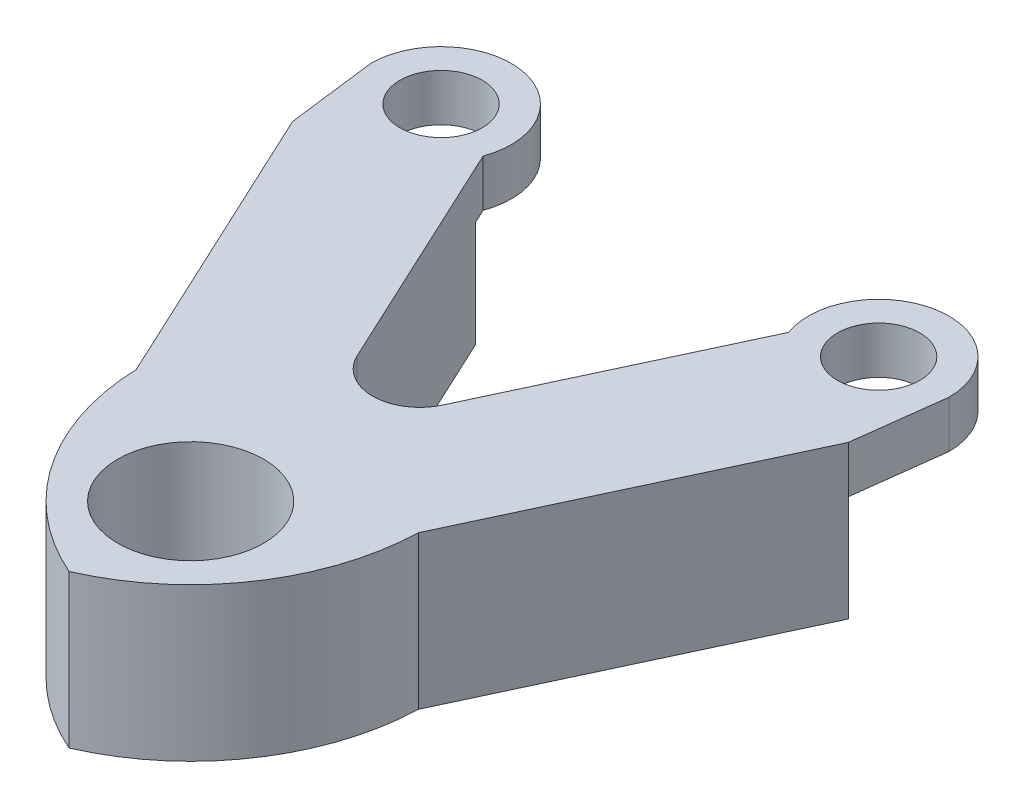
ISO-10303-21;
HEADER;
FILE_DESCRIPTION(('STEP AP214'),'2;1');
FILE_NAME('part.step','',(''),(''),'','','');
FILE_SCHEMA(('AUTOMOTIVE_DESIGN { 1 0 10303 214 1 1 1 1 }'));
ENDSEC;
DATA;
#1=APPLICATION_CONTEXT('core data for automotive mechanical design processes');
#2=APPLICATION_PROTOCOL_DEFINITION('international standard','automotive_design',2000,#1);
#3=PRODUCT_CONTEXT('',#1,'mechanical');
#4=PRODUCT('Part','Part','',(#3));
#5=PRODUCT_RELATED_PRODUCT_CATEGORY('part','',(#4));
#6=PRODUCT_DEFINITION_FORMATION('','',#4);
#7=PRODUCT_DEFINITION_CONTEXT('part definition',#1,'design');
#8=PRODUCT_DEFINITION('design','',#6,#7);
#9=PRODUCT_DEFINITION_SHAPE('','',#8);
#10=(LENGTH_UNIT() NAMED_UNIT(*) SI_UNIT(.MILLI.,.METRE.));
#11=(NAMED_UNIT(*) PLANE_ANGLE_UNIT() SI_UNIT($,.RADIAN.));
#12=(NAMED_UNIT(*) SI_UNIT($,.STERADIAN.) SOLID_ANGLE_UNIT());
#13=UNCERTAINTY_MEASURE_WITH_UNIT(LENGTH_MEASURE(1.E-05),#10,'distance_accuracy_value','');
#14=(GEOMETRIC_REPRESENTATION_CONTEXT(3) GLOBAL_UNCERTAINTY_ASSIGNED_CONTEXT((#13)) GLOBAL_UNIT_ASSIGNED_CONTEXT((#10,
#11,#12)) REPRESENTATION_CONTEXT('',''));
#15=CARTESIAN_POINT('',(0.,0.,0.));
#16=DIRECTION('',(0.,0.,1.));
#17=DIRECTION('',(1.,0.,0.));
#18=AXIS2_PLACEMENT_3D('',#15,#16,#17);
#19=CARTESIAN_POINT('',(0.,6.5,0.));
#20=DIRECTION('',(0.,-1.,0.));
#21=DIRECTION('',(0.,0.,-1.));
#22=AXIS2_PLACEMENT_3D('',#19,#20,#21);
#23=CYLINDRICAL_SURFACE('',#22,20.);
#24=DIRECTION('',(0.,-1.,0.));
#25=VECTOR('',#24,1.);
#26=CARTESIAN_POINT('',(10.8493263239775,9.76597930857815,-16.8015510687511));
#27=LINE('',#26,#25);
#28=CARTESIAN_POINT('',(10.8493263239775,4.5,-16.8015510687511));
#29=VERTEX_POINT('',#28);
#30=CARTESIAN_POINT('',(10.8493263239775,0.,-16.8015510687511));
#31=VERTEX_POINT('',#30);
#32=EDGE_CURVE('E198',#29,#31,#27,.T.);
#33=ORIENTED_EDGE('',*,*,#32,.F.);
#34=CARTESIAN_POINT('',(0.,4.5,0.));
#35=DIRECTION('',(0.,1.,0.));
#36=DIRECTION('',(0.,0.,1.));
#37=AXIS2_PLACEMENT_3D('',#34,#35,#36);
#38=CIRCLE('',#37,20.);
#39=CARTESIAN_POINT('',(11.8090070067052,4.5,-16.1414792852324));
#40=VERTEX_POINT('',#39);
#41=EDGE_CURVE('E229',#40,#29,#38,.T.);
#42=ORIENTED_EDGE('',*,*,#41,.F.);
#43=DIRECTION('',(0.,-1.,0.));
#44=VECTOR('',#43,1.);
#45=CARTESIAN_POINT('',(11.8090070067052,6.5,-16.1414792852324));
#46=LINE('',#45,#44);
#47=CARTESIAN_POINT('',(11.8090070067052,0.,-16.1414792852324));
#48=VERTEX_POINT('',#47);
#49=EDGE_CURVE('E222',#40,#48,#46,.T.);
#50=ORIENTED_EDGE('',*,*,#49,.T.);
#51=CARTESIAN_POINT('',(0.,0.,0.));
#52=DIRECTION('',(0.,1.,0.));
#53=DIRECTION('',(0.,0.,1.));
#54=AXIS2_PLACEMENT_3D('',#51,#52,#53);
#55=CIRCLE('',#54,20.);
#56=EDGE_CURVE('E211',#48,#31,#55,.T.);
#57=ORIENTED_EDGE('',*,*,#56,.T.);
#58=EDGE_LOOP('',(#33,#42,#50,#57));
#59=FACE_BOUND('',#58,.T.);
#60=ADVANCED_FACE('F80',(#59),#23,.T.);
#61=CARTESIAN_POINT('',(0.,0.,0.));
#62=DIRECTION('',(0.,1.,0.));
#63=DIRECTION('',(0.,0.,1.));
#64=AXIS2_PLACEMENT_3D('',#61,#62,#63);
#65=PLANE('',#64);
#66=CARTESIAN_POINT('',(0.,0.,0.));
#67=DIRECTION('',(0.,-1.,0.));
#68=DIRECTION('',(0.,0.,-1.));
#69=AXIS2_PLACEMENT_3D('',#66,#67,#68);
#70=CIRCLE('',#69,3.1);
#71=CARTESIAN_POINT('',(0.,0.,-3.1));
#72=VERTEX_POINT('',#71);
#73=EDGE_CURVE('E336',#72,#72,#70,.T.);
#74=ORIENTED_EDGE('',*,*,#73,.F.);
#75=EDGE_LOOP('',(#74));
#76=FACE_BOUND('',#75,.T.);
#77=DIRECTION('',(-0.422618261740693,0.,0.906307787036653));
#78=VECTOR('',#77,1.);
#79=CARTESIAN_POINT('',(3.5172999415724,0.,1.64014389878331));
#80=LINE('',#79,#78);
#81=CARTESIAN_POINT('',(6.,0.,-3.68402355806427));
#82=VERTEX_POINT('',#81);
#83=EDGE_CURVE('E216',#48,#82,#80,.T.);
#84=ORIENTED_EDGE('',*,*,#83,.T.);
#85=CARTESIAN_POINT('',(-3.99500669775371,0.,-4.));
#86=DIRECTION('',(0.,1.,0.));
#87=DIRECTION('',(0.,0.,1.));
#88=AXIS2_PLACEMENT_3D('',#85,#86,#87);
#89=CIRCLE('',#88,10.);
#90=CARTESIAN_POINT('',(0.,0.,5.16732902676145));
#91=VERTEX_POINT('',#90);
#92=EDGE_CURVE('E257',#82,#91,#89,.F.);
#93=ORIENTED_EDGE('',*,*,#92,.T.);
#94=CARTESIAN_POINT('',(3.99500669775371,0.,-4.));
#95=DIRECTION('',(0.,1.,0.));
#96=DIRECTION('',(0.,0.,1.));
#97=AXIS2_PLACEMENT_3D('',#94,#95,#96);
#98=CIRCLE('',#97,10.);
#99=CARTESIAN_POINT('',(-6.,0.,-3.68402355806427));
#100=VERTEX_POINT('',#99);
#101=EDGE_CURVE('E255',#91,#100,#98,.F.);
#102=ORIENTED_EDGE('',*,*,#101,.T.);
#103=DIRECTION('',(0.422618261740694,0.,0.906307787036653));
#104=VECTOR('',#103,1.);
#105=CARTESIAN_POINT('',(-11.8090070067053,0.,-16.1414792852324));
#106=LINE('',#105,#104);
#107=CARTESIAN_POINT('',(-11.8090070067052,0.,-16.1414792852324));
#108=VERTEX_POINT('',#107);
#109=EDGE_CURVE('E237',#108,#100,#106,.T.);
#110=ORIENTED_EDGE('',*,*,#109,.F.);
#111=CARTESIAN_POINT('',(0.,0.,0.));
#112=DIRECTION('',(0.,1.,0.));
#113=DIRECTION('',(0.,0.,1.));
#114=AXIS2_PLACEMENT_3D('',#111,#112,#113);
#115=CIRCLE('',#114,20.);
#116=CARTESIAN_POINT('',(-10.8493263239775,0.,-16.8015510687511));
#117=VERTEX_POINT('',#116);
#118=EDGE_CURVE('E240',#117,#108,#115,.T.);
#119=ORIENTED_EDGE('',*,*,#118,.F.);
#120=CARTESIAN_POINT('',(-9.29760175829541,0.,-19.9387713148063));
#121=DIRECTION('',(0.,-1.,0.));
#122=DIRECTION('',(0.,0.,-1.));
#123=AXIS2_PLACEMENT_3D('',#120,#121,#122);
#124=CIRCLE('',#123,3.5);
#125=CARTESIAN_POINT('',(-6.2033292675817,0.,-18.3030825445286));
#126=VERTEX_POINT('',#125);
#127=EDGE_CURVE('E267',#126,#117,#124,.T.);
#128=ORIENTED_EDGE('',*,*,#127,.F.);
#129=DIRECTION('',(0.422618261740694,0.,0.906307787036653));
#130=VECTOR('',#129,1.);
#131=CARTESIAN_POINT('',(-6.48994533097687,0.,-18.9177326760088));
#132=LINE('',#131,#130);
#133=CARTESIAN_POINT('',(-1.81261557407331,0.,-8.88716664282367));
#134=VERTEX_POINT('',#133);
#135=EDGE_CURVE('E233',#126,#134,#132,.T.);
#136=ORIENTED_EDGE('',*,*,#135,.T.);
#137=CARTESIAN_POINT('',(0.,0.,-9.73240316630506));
#138=DIRECTION('',(0.,1.,0.));
#139=DIRECTION('',(0.,0.,1.));
#140=AXIS2_PLACEMENT_3D('',#137,#138,#139);
#141=CIRCLE('',#140,2.);
#142=CARTESIAN_POINT('',(1.81261557407331,0.,-8.88716664282368));
#143=VERTEX_POINT('',#142);
#144=EDGE_CURVE('E88',#134,#143,#141,.T.);
#145=ORIENTED_EDGE('',*,*,#144,.T.);
#146=DIRECTION('',(-0.422618261740693,0.,0.906307787036653));
#147=VECTOR('',#146,1.);
#148=CARTESIAN_POINT('',(-1.91511110779742,0.,-0.893030975783625));
#149=LINE('',#148,#147);
#150=CARTESIAN_POINT('',(6.20332926758169,0.,-18.3030825445287));
#151=VERTEX_POINT('',#150);
#152=EDGE_CURVE('E204',#151,#143,#149,.T.);
#153=ORIENTED_EDGE('',*,*,#152,.F.);
#154=CARTESIAN_POINT('',(9.29760175829541,0.,-19.9387713148063));
#155=DIRECTION('',(0.,-1.,0.));
#156=DIRECTION('',(0.,0.,-1.));
#157=AXIS2_PLACEMENT_3D('',#154,#155,#156);
#158=CIRCLE('',#157,3.5);
#159=EDGE_CURVE('E192',#151,#31,#158,.F.);
#160=ORIENTED_EDGE('',*,*,#159,.T.);
#161=ORIENTED_EDGE('',*,*,#56,.F.);
#162=EDGE_LOOP('',(#84,#93,#102,#110,#119,#128,#136,#145,#153,#160,#161));
#163=FACE_BOUND('',#162,.T.);
#164=ADVANCED_FACE('F209',(#76,#163),#65,.F.);
#165=CARTESIAN_POINT('',(-1.91511110779742,6.5,-0.893030975783625));
#166=DIRECTION('',(0.906307787036653,0.,0.422618261740693));
#167=DIRECTION('',(0.422618261740693,0.,-0.906307787036653));
#168=AXIS2_PLACEMENT_3D('',#165,#166,#167);
#169=PLANE('',#168);
#170=ORIENTED_EDGE('',*,*,#152,.T.);
#171=DIRECTION('',(0.,-1.,0.));
#172=VECTOR('',#171,1.);
#173=CARTESIAN_POINT('',(1.8126155740733,6.5,-8.88716664282367));
#174=LINE('',#173,#172);
#175=CARTESIAN_POINT('',(1.81261557407331,6.5,-8.88716664282368));
#176=VERTEX_POINT('',#175);
#177=EDGE_CURVE('E95',#143,#176,#174,.F.);
#178=ORIENTED_EDGE('',*,*,#177,.T.);
#179=DIRECTION('',(-0.422618261740693,0.,0.906307787036653));
#180=VECTOR('',#179,1.);
#181=CARTESIAN_POINT('',(-1.91511110779742,6.5,-0.893030975783625));
#182=LINE('',#181,#180);
#183=CARTESIAN_POINT('',(6.48994533097686,6.5,-18.9177326760088));
#184=VERTEX_POINT('',#183);
#185=EDGE_CURVE('E214',#184,#176,#182,.T.);
#186=ORIENTED_EDGE('',*,*,#185,.F.);
#187=DIRECTION('',(0.,-1.,0.));
#188=VECTOR('',#187,1.);
#189=CARTESIAN_POINT('',(6.48994533097686,6.5,-18.9177326760088));
#190=LINE('',#189,#188);
#191=CARTESIAN_POINT('',(6.48994533097686,4.5,-18.9177326760088));
#192=VERTEX_POINT('',#191);
#193=EDGE_CURVE('E220',#184,#192,#190,.T.);
#194=ORIENTED_EDGE('',*,*,#193,.T.);
#195=DIRECTION('',(-0.422618261740693,0.,0.906307787036653));
#196=VECTOR('',#195,1.);
#197=CARTESIAN_POINT('',(-1.91511110779742,4.5,-0.893030975783625));
#198=LINE('',#197,#196);
#199=CARTESIAN_POINT('',(6.20332926758169,4.5,-18.3030825445287));
#200=VERTEX_POINT('',#199);
#201=EDGE_CURVE('E206',#192,#200,#198,.T.);
#202=ORIENTED_EDGE('',*,*,#201,.T.);
#203=DIRECTION('',(0.,-1.,0.));
#204=VECTOR('',#203,1.);
#205=CARTESIAN_POINT('',(6.20332926758169,9.76597930857815,-18.3030825445287));
#206=LINE('',#205,#204);
#207=EDGE_CURVE('E195',#200,#151,#206,.T.);
#208=ORIENTED_EDGE('',*,*,#207,.T.);
#209=EDGE_LOOP('',(#170,#178,#186,#194,#202,#208));
#210=FACE_BOUND('',#209,.T.);
#211=ADVANCED_FACE('F203',(#210),#169,.F.);
#212=CARTESIAN_POINT('',(3.5172999415724,6.5,1.64014389878331));
#213=DIRECTION('',(0.906307787036653,0.,0.422618261740693));
#214=DIRECTION('',(0.422618261740693,0.,-0.906307787036653));
#215=AXIS2_PLACEMENT_3D('',#212,#213,#214);
#216=PLANE('',#215);
#217=ORIENTED_EDGE('',*,*,#83,.F.);
#218=ORIENTED_EDGE('',*,*,#49,.F.);
#219=CARTESIAN_POINT('',(11.8090070067052,6.5,-16.1414792852324));
#220=VERTEX_POINT('',#219);
#221=EDGE_CURVE('E223',#220,#40,#46,.T.);
#222=ORIENTED_EDGE('',*,*,#221,.F.);
#223=DIRECTION('',(-0.422618261740693,0.,0.906307787036653));
#224=VECTOR('',#223,1.);
#225=CARTESIAN_POINT('',(3.5172999415724,6.5,1.64014389878331));
#226=LINE('',#225,#224);
#227=CARTESIAN_POINT('',(6.,6.5,-3.68402355806427));
#228=VERTEX_POINT('',#227);
#229=EDGE_CURVE('E210',#220,#228,#226,.T.);
#230=ORIENTED_EDGE('',*,*,#229,.T.);
#231=DIRECTION('',(0.,-1.,0.));
#232=VECTOR('',#231,1.);
#233=CARTESIAN_POINT('',(6.,6.5,-3.68402355806427));
#234=LINE('',#233,#232);
#235=EDGE_CURVE('E226',#228,#82,#234,.T.);
#236=ORIENTED_EDGE('',*,*,#235,.T.);
#237=EDGE_LOOP('',(#217,#218,#222,#230,#236));
#238=FACE_BOUND('',#237,.T.);
#239=ADVANCED_FACE('F344',(#238),#216,.T.);
#240=CARTESIAN_POINT('',(0.,6.5,0.));
#241=DIRECTION('',(0.,1.,0.));
#242=DIRECTION('',(0.,0.,1.));
#243=AXIS2_PLACEMENT_3D('',#240,#241,#242);
#244=PLANE('',#243);
#245=CARTESIAN_POINT('',(3.99500669775371,6.5,-4.));
#246=DIRECTION('',(0.,1.,0.));
#247=DIRECTION('',(0.,0.,1.));
#248=AXIS2_PLACEMENT_3D('',#245,#246,#247);
#249=CIRCLE('',#248,10.);
#250=CARTESIAN_POINT('',(-6.,6.5,-3.68402355806427));
#251=VERTEX_POINT('',#250);
#252=CARTESIAN_POINT('',(0.,6.5,5.16732902676145));
#253=VERTEX_POINT('',#252);
#254=EDGE_CURVE('E259',#251,#253,#249,.T.);
#255=ORIENTED_EDGE('',*,*,#254,.T.);
#256=CARTESIAN_POINT('',(-3.99500669775371,6.5,-4.));
#257=DIRECTION('',(0.,1.,0.));
#258=DIRECTION('',(0.,0.,1.));
#259=AXIS2_PLACEMENT_3D('',#256,#257,#258);
#260=CIRCLE('',#259,10.);
#261=EDGE_CURVE('E261',#253,#228,#260,.T.);
#262=ORIENTED_EDGE('',*,*,#261,.T.);
#263=ORIENTED_EDGE('',*,*,#229,.F.);
#264=DIRECTION('',(0.124416313592816,0.,-0.992230104820436));
#265=VECTOR('',#264,1.);
#266=CARTESIAN_POINT('',(12.2851516768374,6.5,-19.9387713148063));
#267=LINE('',#266,#265);
#268=CARTESIAN_POINT('',(12.2851516768374,6.5,-19.9387713148063));
#269=VERTEX_POINT('',#268);
#270=EDGE_CURVE('E305',#220,#269,#267,.T.);
#271=ORIENTED_EDGE('',*,*,#270,.T.);
#272=CARTESIAN_POINT('',(9.29760175829541,6.5,-19.9387713148063));
#273=DIRECTION('',(0.,1.,0.));
#274=DIRECTION('',(0.,0.,1.));
#275=AXIS2_PLACEMENT_3D('',#272,#273,#274);
#276=CIRCLE('',#275,2.98754991854204);
#277=EDGE_CURVE('E297',#269,#184,#276,.T.);
#278=ORIENTED_EDGE('',*,*,#277,.T.);
#279=ORIENTED_EDGE('',*,*,#185,.T.);
#280=CARTESIAN_POINT('',(0.,6.5,-9.73240316630506));
#281=DIRECTION('',(0.,1.,0.));
#282=DIRECTION('',(0.,0.,1.));
#283=AXIS2_PLACEMENT_3D('',#280,#281,#282);
#284=CIRCLE('',#283,2.);
#285=CARTESIAN_POINT('',(-1.81261557407331,6.5,-8.88716664282367));
#286=VERTEX_POINT('',#285);
#287=EDGE_CURVE('E12',#176,#286,#284,.F.);
#288=ORIENTED_EDGE('',*,*,#287,.T.);
#289=DIRECTION('',(0.422618261740694,0.,0.906307787036653));
#290=VECTOR('',#289,1.);
#291=CARTESIAN_POINT('',(-6.48994533097687,6.5,-18.9177326760088));
#292=LINE('',#291,#290);
#293=CARTESIAN_POINT('',(-6.48994533097687,6.5,-18.9177326760088));
#294=VERTEX_POINT('',#293);
#295=EDGE_CURVE('E232',#294,#286,#292,.T.);
#296=ORIENTED_EDGE('',*,*,#295,.F.);
#297=CARTESIAN_POINT('',(-9.29760175829541,6.5,-19.9387713148063));
#298=DIRECTION('',(0.,1.,0.));
#299=DIRECTION('',(0.,0.,-1.));
#300=AXIS2_PLACEMENT_3D('',#297,#298,#299);
#301=CIRCLE('',#300,2.98754991854204);
#302=CARTESIAN_POINT('',(-12.2851516768374,6.5,-19.9387713148063));
#303=VERTEX_POINT('',#302);
#304=EDGE_CURVE('E318',#294,#303,#301,.T.);
#305=ORIENTED_EDGE('',*,*,#304,.T.);
#306=DIRECTION('',(0.124416313592816,0.,0.992230104820436));
#307=VECTOR('',#306,1.);
#308=CARTESIAN_POINT('',(-12.2851516768374,6.5,-19.9387713148063));
#309=LINE('',#308,#307);
#310=CARTESIAN_POINT('',(-11.8090070067052,6.5,-16.1414792852324));
#311=VERTEX_POINT('',#310);
#312=EDGE_CURVE('E324',#303,#311,#309,.T.);
#313=ORIENTED_EDGE('',*,*,#312,.T.);
#314=DIRECTION('',(0.422618261740694,0.,0.906307787036653));
#315=VECTOR('',#314,1.);
#316=CARTESIAN_POINT('',(-11.8090070067053,6.5,-16.1414792852324));
#317=LINE('',#316,#315);
#318=EDGE_CURVE('E230',#311,#251,#317,.T.);
#319=ORIENTED_EDGE('',*,*,#318,.T.);
#320=EDGE_LOOP('',(#255,#262,#263,#271,#278,#279,#288,#296,#305,#313,#319));
#321=FACE_BOUND('',#320,.T.);
#322=CARTESIAN_POINT('',(0.,6.5,0.));
#323=DIRECTION('',(0.,-1.,0.));
#324=DIRECTION('',(0.,0.,-1.));
#325=AXIS2_PLACEMENT_3D('',#322,#323,#324);
#326=CIRCLE('',#325,3.1);
#327=CARTESIAN_POINT('',(0.,6.5,-3.1));
#328=VERTEX_POINT('',#327);
#329=EDGE_CURVE('E241',#328,#328,#326,.T.);
#330=ORIENTED_EDGE('',*,*,#329,.T.);
#331=EDGE_LOOP('',(#330));
#332=FACE_BOUND('',#331,.T.);
#333=CARTESIAN_POINT('',(-9.29760175829541,6.5,-19.9387713148063));
#334=DIRECTION('',(0.,1.,0.));
#335=DIRECTION('',(0.,0.,-1.));
#336=AXIS2_PLACEMENT_3D('',#333,#334,#335);
#337=CIRCLE('',#336,1.75);
#338=CARTESIAN_POINT('',(-9.29760175829541,6.5,-21.6887713148063));
#339=VERTEX_POINT('',#338);
#340=EDGE_CURVE('E314',#339,#339,#337,.T.);
#341=ORIENTED_EDGE('',*,*,#340,.F.);
#342=EDGE_LOOP('',(#341));
#343=FACE_BOUND('',#342,.T.);
#344=CARTESIAN_POINT('',(9.29760175829541,6.5,-19.9387713148063));
#345=DIRECTION('',(0.,1.,0.));
#346=DIRECTION('',(0.,0.,1.));
#347=AXIS2_PLACEMENT_3D('',#344,#345,#346);
#348=CIRCLE('',#347,1.75);
#349=CARTESIAN_POINT('',(9.29760175829541,6.5,-18.1887713148063));
#350=VERTEX_POINT('',#349);
#351=EDGE_CURVE('E298',#350,#350,#348,.T.);
#352=ORIENTED_EDGE('',*,*,#351,.F.);
#353=EDGE_LOOP('',(#352));
#354=FACE_BOUND('',#353,.T.);
#355=ADVANCED_FACE('F375',(#321,#332,#343,#354),#244,.T.);
#356=CARTESIAN_POINT('',(-11.8090070067053,6.5,-16.1414792852324));
#357=DIRECTION('',(0.906307787036653,0.,-0.422618261740694));
#358=DIRECTION('',(-0.422618261740694,0.,-0.906307787036653));
#359=AXIS2_PLACEMENT_3D('',#356,#357,#358);
#360=PLANE('',#359);
#361=ORIENTED_EDGE('',*,*,#109,.T.);
#362=DIRECTION('',(0.,-1.,0.));
#363=VECTOR('',#362,1.);
#364=CARTESIAN_POINT('',(-6.,6.5,-3.68402355806427));
#365=LINE('',#364,#363);
#366=EDGE_CURVE('E236',#251,#100,#365,.T.);
#367=ORIENTED_EDGE('',*,*,#366,.F.);
#368=ORIENTED_EDGE('',*,*,#318,.F.);
#369=DIRECTION('',(0.,-1.,0.));
#370=VECTOR('',#369,1.);
#371=CARTESIAN_POINT('',(-11.8090070067052,6.5,-16.1414792852324));
#372=LINE('',#371,#370);
#373=CARTESIAN_POINT('',(-11.8090070067052,4.5,-16.1414792852324));
#374=VERTEX_POINT('',#373);
#375=EDGE_CURVE('E247',#311,#374,#372,.T.);
#376=ORIENTED_EDGE('',*,*,#375,.T.);
#377=EDGE_CURVE('E250',#374,#108,#372,.T.);
#378=ORIENTED_EDGE('',*,*,#377,.T.);
#379=EDGE_LOOP('',(#361,#367,#368,#376,#378));
#380=FACE_BOUND('',#379,.T.);
#381=ADVANCED_FACE('F358',(#380),#360,.F.);
#382=CARTESIAN_POINT('',(0.,6.5,0.));
#383=DIRECTION('',(0.,-1.,0.));
#384=DIRECTION('',(0.,0.,-1.));
#385=AXIS2_PLACEMENT_3D('',#382,#383,#384);
#386=CYLINDRICAL_SURFACE('',#385,20.);
#387=CARTESIAN_POINT('',(0.,4.5,0.));
#388=DIRECTION('',(0.,-1.,0.));
#389=DIRECTION('',(0.,0.,-1.));
#390=AXIS2_PLACEMENT_3D('',#387,#388,#389);
#391=CIRCLE('',#390,20.);
#392=CARTESIAN_POINT('',(-10.8493263239775,4.5,-16.8015510687511));
#393=VERTEX_POINT('',#392);
#394=EDGE_CURVE('E333',#374,#393,#391,.T.);
#395=ORIENTED_EDGE('',*,*,#394,.T.);
#396=DIRECTION('',(0.,-1.,0.));
#397=VECTOR('',#396,1.);
#398=CARTESIAN_POINT('',(-10.8493263239775,9.76597930857815,-16.8015510687511));
#399=LINE('',#398,#397);
#400=EDGE_CURVE('E286',#393,#117,#399,.T.);
#401=ORIENTED_EDGE('',*,*,#400,.T.);
#402=ORIENTED_EDGE('',*,*,#118,.T.);
#403=ORIENTED_EDGE('',*,*,#377,.F.);
#404=EDGE_LOOP('',(#395,#401,#402,#403));
#405=FACE_BOUND('',#404,.T.);
#406=ADVANCED_FACE('F362',(#405),#386,.T.);
#407=CARTESIAN_POINT('',(-6.48994533097687,6.5,-18.9177326760088));
#408=DIRECTION('',(0.906307787036653,0.,-0.422618261740694));
#409=DIRECTION('',(-0.422618261740694,0.,-0.906307787036653));
#410=AXIS2_PLACEMENT_3D('',#407,#408,#409);
#411=PLANE('',#410);
#412=ORIENTED_EDGE('',*,*,#295,.T.);
#413=DIRECTION('',(0.,-1.,0.));
#414=VECTOR('',#413,1.);
#415=CARTESIAN_POINT('',(-1.81261557407331,6.5,-8.88716664282367));
#416=LINE('',#415,#414);
#417=EDGE_CURVE('E263',#286,#134,#416,.T.);
#418=ORIENTED_EDGE('',*,*,#417,.T.);
#419=ORIENTED_EDGE('',*,*,#135,.F.);
#420=DIRECTION('',(0.,-1.,0.));
#421=VECTOR('',#420,1.);
#422=CARTESIAN_POINT('',(-6.2033292675817,9.76597930857815,-18.3030825445286));
#423=LINE('',#422,#421);
#424=CARTESIAN_POINT('',(-6.2033292675817,4.5,-18.3030825445286));
#425=VERTEX_POINT('',#424);
#426=EDGE_CURVE('E284',#425,#126,#423,.T.);
#427=ORIENTED_EDGE('',*,*,#426,.F.);
#428=DIRECTION('',(-0.422618261740694,0.,-0.906307787036653));
#429=VECTOR('',#428,1.);
#430=CARTESIAN_POINT('',(1.91511110779742,4.5,-0.893030975783628));
#431=LINE('',#430,#429);
#432=CARTESIAN_POINT('',(-6.48994533097687,4.5,-18.9177326760088));
#433=VERTEX_POINT('',#432);
#434=EDGE_CURVE('E290',#425,#433,#431,.T.);
#435=ORIENTED_EDGE('',*,*,#434,.T.);
#436=DIRECTION('',(0.,-1.,0.));
#437=VECTOR('',#436,1.);
#438=CARTESIAN_POINT('',(-6.48994533097687,6.5,-18.9177326760088));
#439=LINE('',#438,#437);
#440=EDGE_CURVE('E244',#294,#433,#439,.T.);
#441=ORIENTED_EDGE('',*,*,#440,.F.);
#442=EDGE_LOOP('',(#412,#418,#419,#427,#435,#441));
#443=FACE_BOUND('',#442,.T.);
#444=ADVANCED_FACE('F273',(#443),#411,.T.);
#445=CARTESIAN_POINT('',(0.,6.5,0.));
#446=DIRECTION('',(0.,-1.,0.));
#447=DIRECTION('',(0.,0.,-1.));
#448=AXIS2_PLACEMENT_3D('',#445,#446,#447);
#449=CYLINDRICAL_SURFACE('',#448,3.1);
#450=CARTESIAN_POINT('',(0.,6.5,-3.1));
#451=CARTESIAN_POINT('',(0.,6.43229166666667,-3.1));
#452=CARTESIAN_POINT('',(0.,6.36458333333333,-3.1));
#453=CARTESIAN_POINT('',(0.,6.22916666666667,-3.1));
#454=CARTESIAN_POINT('',(0.,6.16145833333333,-3.1));
#455=CARTESIAN_POINT('',(0.,6.02604166666667,-3.1));
#456=CARTESIAN_POINT('',(0.,5.95833333333333,-3.1));
#457=CARTESIAN_POINT('',(0.,5.82291666666667,-3.1));
#458=CARTESIAN_POINT('',(0.,5.75520833333333,-3.1));
#459=CARTESIAN_POINT('',(0.,5.61979166666667,-3.1));
#460=CARTESIAN_POINT('',(0.,5.55208333333333,-3.1));
#461=CARTESIAN_POINT('',(0.,5.41666666666667,-3.1));
#462=CARTESIAN_POINT('',(0.,5.34895833333333,-3.1));
#463=CARTESIAN_POINT('',(0.,5.21354166666667,-3.1));
#464=CARTESIAN_POINT('',(0.,5.14583333333333,-3.1));
#465=CARTESIAN_POINT('',(0.,5.01041666666667,-3.1));
#466=CARTESIAN_POINT('',(0.,4.94270833333333,-3.1));
#467=CARTESIAN_POINT('',(0.,4.80729166666667,-3.1));
#468=CARTESIAN_POINT('',(0.,4.73958333333333,-3.1));
#469=CARTESIAN_POINT('',(0.,4.60416666666667,-3.1));
#470=CARTESIAN_POINT('',(0.,4.53645833333333,-3.1));
#471=CARTESIAN_POINT('',(0.,4.40104166666667,-3.1));
#472=CARTESIAN_POINT('',(0.,4.33333333333333,-3.1));
#473=CARTESIAN_POINT('',(0.,4.19791666666667,-3.1));
#474=CARTESIAN_POINT('',(0.,4.13020833333333,-3.1));
#475=CARTESIAN_POINT('',(0.,3.99479166666667,-3.1));
#476=CARTESIAN_POINT('',(0.,3.92708333333333,-3.1));
#477=CARTESIAN_POINT('',(0.,3.79166666666667,-3.1));
#478=CARTESIAN_POINT('',(0.,3.72395833333333,-3.1));
#479=CARTESIAN_POINT('',(0.,3.58854166666667,-3.1));
#480=CARTESIAN_POINT('',(0.,3.52083333333333,-3.1));
#481=CARTESIAN_POINT('',(0.,3.38541666666667,-3.1));
#482=CARTESIAN_POINT('',(0.,3.31770833333333,-3.1));
#483=CARTESIAN_POINT('',(0.,3.18229166666667,-3.1));
#484=CARTESIAN_POINT('',(0.,3.11458333333333,-3.1));
#485=CARTESIAN_POINT('',(0.,2.97916666666667,-3.1));
#486=CARTESIAN_POINT('',(0.,2.91145833333333,-3.1));
#487=CARTESIAN_POINT('',(0.,2.77604166666667,-3.1));
#488=CARTESIAN_POINT('',(0.,2.70833333333333,-3.1));
#489=CARTESIAN_POINT('',(0.,2.57291666666667,-3.1));
#490=CARTESIAN_POINT('',(0.,2.50520833333333,-3.1));
#491=CARTESIAN_POINT('',(0.,2.36979166666667,-3.1));
#492=CARTESIAN_POINT('',(0.,2.30208333333333,-3.1));
#493=CARTESIAN_POINT('',(0.,2.16666666666667,-3.1));
#494=CARTESIAN_POINT('',(0.,2.09895833333333,-3.1));
#495=CARTESIAN_POINT('',(0.,1.96354166666667,-3.1));
#496=CARTESIAN_POINT('',(0.,1.89583333333333,-3.1));
#497=CARTESIAN_POINT('',(0.,1.76041666666667,-3.1));
#498=CARTESIAN_POINT('',(0.,1.69270833333333,-3.1));
#499=CARTESIAN_POINT('',(0.,1.55729166666667,-3.1));
#500=CARTESIAN_POINT('',(0.,1.48958333333333,-3.1));
#501=CARTESIAN_POINT('',(0.,1.35416666666667,-3.1));
#502=CARTESIAN_POINT('',(0.,1.28645833333333,-3.1));
#503=CARTESIAN_POINT('',(0.,1.15104166666667,-3.1));
#504=CARTESIAN_POINT('',(0.,1.08333333333333,-3.1));
#505=CARTESIAN_POINT('',(0.,0.947916666666667,-3.1));
#506=CARTESIAN_POINT('',(0.,0.880208333333333,-3.1));
#507=CARTESIAN_POINT('',(0.,0.744791666666667,-3.1));
#508=CARTESIAN_POINT('',(0.,0.677083333333333,-3.1));
#509=CARTESIAN_POINT('',(0.,0.541666666666667,-3.1));
#510=CARTESIAN_POINT('',(0.,0.473958333333333,-3.1));
#511=CARTESIAN_POINT('',(0.,0.338541666666667,-3.1));
#512=CARTESIAN_POINT('',(0.,0.270833333333334,-3.1));
#513=CARTESIAN_POINT('',(0.,0.135416666666667,-3.1));
#514=CARTESIAN_POINT('',(0.,0.0677083333333334,-3.1));
#515=CARTESIAN_POINT('',(0.,0.,-3.1));
#516=B_SPLINE_CURVE_WITH_KNOTS('',3,(#450,#451,#452,#453,#454,#455,#456,#457,#458,#459,#460,
#461,#462,#463,#464,#465,#466,#467,#468,#469,#470,#471,#472,#473,#474,#475,#476,#477,#478,#479,
#480,#481,#482,#483,#484,#485,#486,#487,#488,#489,#490,#491,#492,#493,#494,#495,#496,#497,#498,
#499,#500,#501,#502,#503,#504,#505,#506,#507,#508,#509,#510,#511,#512,#513,#514,#515),
.UNSPECIFIED.,.F.,.F.,(4,2,2,2,2,2,2,2,2,2,2,2,2,2,2,2,2,2,2,2,2,2,2,2,2,2,2,2,2,2,2,2,4),(0.,
0.203124999999999,0.40625,0.609375,0.8125,1.015625,1.21875,1.421875,1.625,1.828125,2.03125,
2.234375,2.4375,2.640625,2.84375,3.046875,3.25,3.453125,3.65625,3.859375,4.0625,4.265625,
4.46875,4.671875,4.875,5.078125,5.28125,5.484375,5.6875,5.890625,6.09375,6.296875,6.5),.UNSPECIFIED.);
#517=EDGE_CURVE('BSEAM396',#328,#72,#516,.T.);
#518=ORIENTED_EDGE('',*,*,#329,.F.);
#519=ORIENTED_EDGE('',*,*,#73,.T.);
#520=ORIENTED_EDGE('',*,*,#517,.T.);
#521=ORIENTED_EDGE('',*,*,#517,.F.);
#522=EDGE_LOOP('',(#518,#520,#519,#521));
#523=FACE_BOUND('',#522,.T.);
#524=ADVANCED_FACE('F396',(#523),#449,.F.);
#525=CARTESIAN_POINT('',(-9.29760175829541,4.5,-19.9387713148063));
#526=DIRECTION('',(0.,-1.,0.));
#527=DIRECTION('',(0.,0.,-1.));
#528=AXIS2_PLACEMENT_3D('',#525,#526,#527);
#529=PLANE('',#528);
#530=CARTESIAN_POINT('',(-9.29760175829541,4.5,-19.9387713148063));
#531=DIRECTION('',(0.,1.,0.));
#532=DIRECTION('',(0.,0.,-1.));
#533=AXIS2_PLACEMENT_3D('',#530,#531,#532);
#534=CIRCLE('',#533,1.75);
#535=CARTESIAN_POINT('',(-9.29760175829541,4.5,-21.6887713148063));
#536=VERTEX_POINT('',#535);
#537=EDGE_CURVE('E315',#536,#536,#534,.T.);
#538=ORIENTED_EDGE('',*,*,#537,.T.);
#539=EDGE_LOOP('',(#538));
#540=FACE_BOUND('',#539,.T.);
#541=ORIENTED_EDGE('',*,*,#394,.F.);
#542=DIRECTION('',(0.124416313592816,0.,0.992230104820436));
#543=VECTOR('',#542,1.);
#544=CARTESIAN_POINT('',(-12.2851516768374,4.5,-19.9387713148063));
#545=LINE('',#544,#543);
#546=CARTESIAN_POINT('',(-12.2851516768374,4.5,-19.9387713148063));
#547=VERTEX_POINT('',#546);
#548=EDGE_CURVE('E323',#547,#374,#545,.T.);
#549=ORIENTED_EDGE('',*,*,#548,.F.);
#550=CARTESIAN_POINT('',(-9.29760175829541,4.5,-19.9387713148063));
#551=DIRECTION('',(0.,1.,0.));
#552=DIRECTION('',(0.,0.,-1.));
#553=AXIS2_PLACEMENT_3D('',#550,#551,#552);
#554=CIRCLE('',#553,2.98754991854204);
#555=EDGE_CURVE('E321',#433,#547,#554,.T.);
#556=ORIENTED_EDGE('',*,*,#555,.F.);
#557=ORIENTED_EDGE('',*,*,#434,.F.);
#558=CARTESIAN_POINT('',(-9.29760175829541,4.5,-19.9387713148063));
#559=DIRECTION('',(0.,-1.,0.));
#560=DIRECTION('',(0.,0.,-1.));
#561=AXIS2_PLACEMENT_3D('',#558,#559,#560);
#562=CIRCLE('',#561,3.5);
#563=EDGE_CURVE('E201',#393,#425,#562,.F.);
#564=ORIENTED_EDGE('',*,*,#563,.F.);
#565=EDGE_LOOP('',(#541,#549,#556,#557,#564));
#566=FACE_BOUND('',#565,.T.);
#567=ADVANCED_FACE('F367',(#540,#566),#529,.T.);
#568=CARTESIAN_POINT('',(-9.29760175829541,4.5,-19.9387713148063));
#569=DIRECTION('',(0.,1.,0.));
#570=DIRECTION('',(0.,0.,1.));
#571=AXIS2_PLACEMENT_3D('',#568,#569,#570);
#572=CYLINDRICAL_SURFACE('',#571,2.98754991854204);
#573=ORIENTED_EDGE('',*,*,#304,.F.);
#574=ORIENTED_EDGE('',*,*,#440,.T.);
#575=ORIENTED_EDGE('',*,*,#555,.T.);
#576=DIRECTION('',(0.,1.,0.));
#577=VECTOR('',#576,1.);
#578=CARTESIAN_POINT('',(-12.2851516768374,4.5,-19.9387713148063));
#579=LINE('',#578,#577);
#580=EDGE_CURVE('E327',#547,#303,#579,.T.);
#581=ORIENTED_EDGE('',*,*,#580,.T.);
#582=EDGE_LOOP('',(#573,#574,#575,#581));
#583=FACE_BOUND('',#582,.T.);
#584=ADVANCED_FACE('F371',(#583),#572,.T.);
#585=CARTESIAN_POINT('',(-12.2851516768374,4.5,-19.9387713148063));
#586=DIRECTION('',(-0.992230104820436,0.,0.124416313592816));
#587=DIRECTION('',(0.124416313592816,0.,0.992230104820436));
#588=AXIS2_PLACEMENT_3D('',#585,#586,#587);
#589=PLANE('',#588);
#590=ORIENTED_EDGE('',*,*,#312,.F.);
#591=ORIENTED_EDGE('',*,*,#580,.F.);
#592=ORIENTED_EDGE('',*,*,#548,.T.);
#593=ORIENTED_EDGE('',*,*,#375,.F.);
#594=EDGE_LOOP('',(#590,#591,#592,#593));
#595=FACE_BOUND('',#594,.T.);
#596=ADVANCED_FACE('F429',(#595),#589,.T.);
#597=CARTESIAN_POINT('',(-9.29760175829541,4.5,-19.9387713148063));
#598=DIRECTION('',(0.,1.,0.));
#599=DIRECTION('',(0.,0.,1.));
#600=AXIS2_PLACEMENT_3D('',#597,#598,#599);
#601=CYLINDRICAL_SURFACE('',#600,1.75);
#602=ORIENTED_EDGE('',*,*,#537,.F.);
#603=EDGE_LOOP('',(#602));
#604=FACE_BOUND('',#603,.T.);
#605=ORIENTED_EDGE('',*,*,#340,.T.);
#606=EDGE_LOOP('',(#605));
#607=FACE_BOUND('',#606,.T.);
#608=ADVANCED_FACE('F425',(#604,#607),#601,.F.);
#609=CARTESIAN_POINT('',(9.29760175829541,4.5,-19.9387713148063));
#610=DIRECTION('',(0.,1.,0.));
#611=DIRECTION('',(0.,0.,1.));
#612=AXIS2_PLACEMENT_3D('',#609,#610,#611);
#613=CYLINDRICAL_SURFACE('',#612,2.98754991854204);
#614=ORIENTED_EDGE('',*,*,#193,.F.);
#615=ORIENTED_EDGE('',*,*,#277,.F.);
#616=DIRECTION('',(0.,1.,0.));
#617=VECTOR('',#616,1.);
#618=CARTESIAN_POINT('',(12.2851516768374,4.5,-19.9387713148063));
#619=LINE('',#618,#617);
#620=CARTESIAN_POINT('',(12.2851516768374,4.5,-19.9387713148063));
#621=VERTEX_POINT('',#620);
#622=EDGE_CURVE('E308',#621,#269,#619,.T.);
#623=ORIENTED_EDGE('',*,*,#622,.F.);
#624=CARTESIAN_POINT('',(9.29760175829541,4.5,-19.9387713148063));
#625=DIRECTION('',(0.,1.,0.));
#626=DIRECTION('',(0.,0.,1.));
#627=AXIS2_PLACEMENT_3D('',#624,#625,#626);
#628=CIRCLE('',#627,2.98754991854204);
#629=EDGE_CURVE('E301',#621,#192,#628,.T.);
#630=ORIENTED_EDGE('',*,*,#629,.T.);
#631=EDGE_LOOP('',(#614,#615,#623,#630));
#632=FACE_BOUND('',#631,.T.);
#633=ADVANCED_FACE('F421',(#632),#613,.T.);
#634=CARTESIAN_POINT('',(12.2851516768374,4.5,-19.9387713148063));
#635=DIRECTION('',(0.992230104820436,0.,0.124416313592816));
#636=DIRECTION('',(0.124416313592816,0.,-0.992230104820436));
#637=AXIS2_PLACEMENT_3D('',#634,#635,#636);
#638=PLANE('',#637);
#639=ORIENTED_EDGE('',*,*,#270,.F.);
#640=ORIENTED_EDGE('',*,*,#221,.T.);
#641=DIRECTION('',(0.124416313592816,0.,-0.992230104820436));
#642=VECTOR('',#641,1.);
#643=CARTESIAN_POINT('',(12.2851516768374,4.5,-19.9387713148063));
#644=LINE('',#643,#642);
#645=EDGE_CURVE('E304',#40,#621,#644,.T.);
#646=ORIENTED_EDGE('',*,*,#645,.T.);
#647=ORIENTED_EDGE('',*,*,#622,.T.);
#648=EDGE_LOOP('',(#639,#640,#646,#647));
#649=FACE_BOUND('',#648,.T.);
#650=ADVANCED_FACE('F417',(#649),#638,.T.);
#651=CARTESIAN_POINT('',(9.29760175829541,4.5,-19.9387713148063));
#652=DIRECTION('',(0.,1.,0.));
#653=DIRECTION('',(0.,0.,1.));
#654=AXIS2_PLACEMENT_3D('',#651,#652,#653);
#655=PLANE('',#654);
#656=CARTESIAN_POINT('',(9.29760175829541,4.5,-19.9387713148063));
#657=DIRECTION('',(0.,1.,0.));
#658=DIRECTION('',(0.,0.,1.));
#659=AXIS2_PLACEMENT_3D('',#656,#657,#658);
#660=CIRCLE('',#659,1.75);
#661=CARTESIAN_POINT('',(9.29760175829541,4.5,-18.1887713148063));
#662=VERTEX_POINT('',#661);
#663=EDGE_CURVE('E294',#662,#662,#660,.T.);
#664=ORIENTED_EDGE('',*,*,#663,.T.);
#665=EDGE_LOOP('',(#664));
#666=FACE_BOUND('',#665,.T.);
#667=ORIENTED_EDGE('',*,*,#645,.F.);
#668=ORIENTED_EDGE('',*,*,#41,.T.);
#669=CARTESIAN_POINT('',(9.29760175829541,4.5,-19.9387713148063));
#670=DIRECTION('',(0.,-1.,0.));
#671=DIRECTION('',(0.,0.,-1.));
#672=AXIS2_PLACEMENT_3D('',#669,#670,#671);
#673=CIRCLE('',#672,3.5);
#674=EDGE_CURVE('E605',#29,#200,#673,.T.);
#675=ORIENTED_EDGE('',*,*,#674,.T.);
#676=ORIENTED_EDGE('',*,*,#201,.F.);
#677=ORIENTED_EDGE('',*,*,#629,.F.);
#678=EDGE_LOOP('',(#667,#668,#675,#676,#677));
#679=FACE_BOUND('',#678,.T.);
#680=ADVANCED_FACE('F413',(#666,#679),#655,.F.);
#681=CARTESIAN_POINT('',(9.29760175829541,4.5,-19.9387713148063));
#682=DIRECTION('',(0.,1.,0.));
#683=DIRECTION('',(0.,0.,1.));
#684=AXIS2_PLACEMENT_3D('',#681,#682,#683);
#685=CYLINDRICAL_SURFACE('',#684,1.75);
#686=ORIENTED_EDGE('',*,*,#663,.F.);
#687=EDGE_LOOP('',(#686));
#688=FACE_BOUND('',#687,.T.);
#689=ORIENTED_EDGE('',*,*,#351,.T.);
#690=EDGE_LOOP('',(#689));
#691=FACE_BOUND('',#690,.T.);
#692=ADVANCED_FACE('F408',(#688,#691),#685,.F.);
#693=CARTESIAN_POINT('',(9.29760175829541,9.76597930857815,-19.9387713148063));
#694=DIRECTION('',(0.,-1.,0.));
#695=DIRECTION('',(0.,0.,-1.));
#696=AXIS2_PLACEMENT_3D('',#693,#694,#695);
#697=CYLINDRICAL_SURFACE('',#696,3.5);
#698=ORIENTED_EDGE('',*,*,#32,.T.);
#699=ORIENTED_EDGE('',*,*,#159,.F.);
#700=ORIENTED_EDGE('',*,*,#207,.F.);
#701=ORIENTED_EDGE('',*,*,#674,.F.);
#702=EDGE_LOOP('',(#698,#699,#700,#701));
#703=FACE_BOUND('',#702,.T.);
#704=ADVANCED_FACE('F194',(#703),#697,.F.);
#705=CARTESIAN_POINT('',(-9.29760175829541,9.76597930857815,-19.9387713148063));
#706=DIRECTION('',(0.,-1.,0.));
#707=DIRECTION('',(0.,0.,-1.));
#708=AXIS2_PLACEMENT_3D('',#705,#706,#707);
#709=CYLINDRICAL_SURFACE('',#708,3.5);
#710=ORIENTED_EDGE('',*,*,#563,.T.);
#711=ORIENTED_EDGE('',*,*,#426,.T.);
#712=ORIENTED_EDGE('',*,*,#127,.T.);
#713=ORIENTED_EDGE('',*,*,#400,.F.);
#714=EDGE_LOOP('',(#710,#711,#712,#713));
#715=FACE_BOUND('',#714,.T.);
#716=ADVANCED_FACE('F363',(#715),#709,.F.);
#717=CARTESIAN_POINT('',(3.99500669775371,6.5,-4.));
#718=DIRECTION('',(0.,1.,0.));
#719=DIRECTION('',(0.,0.,1.));
#720=AXIS2_PLACEMENT_3D('',#717,#718,#719);
#721=CYLINDRICAL_SURFACE('',#720,10.);
#722=DIRECTION('',(0.,1.,0.));
#723=VECTOR('',#722,1.);
#724=CARTESIAN_POINT('',(0.,3.25,5.16732902676145));
#725=LINE('',#724,#723);
#726=EDGE_CURVE('E264',#253,#91,#725,.F.);
#727=ORIENTED_EDGE('',*,*,#726,.F.);
#728=ORIENTED_EDGE('',*,*,#254,.F.);
#729=ORIENTED_EDGE('',*,*,#366,.T.);
#730=ORIENTED_EDGE('',*,*,#101,.F.);
#731=EDGE_LOOP('',(#727,#728,#729,#730));
#732=FACE_BOUND('',#731,.T.);
#733=ADVANCED_FACE('F354',(#732),#721,.T.);
#734=CARTESIAN_POINT('',(-3.99500669775371,6.5,-4.));
#735=DIRECTION('',(0.,-1.,0.));
#736=DIRECTION('',(0.,0.,-1.));
#737=AXIS2_PLACEMENT_3D('',#734,#735,#736);
#738=CYLINDRICAL_SURFACE('',#737,10.);
#739=ORIENTED_EDGE('',*,*,#261,.F.);
#740=ORIENTED_EDGE('',*,*,#726,.T.);
#741=ORIENTED_EDGE('',*,*,#92,.F.);
#742=ORIENTED_EDGE('',*,*,#235,.F.);
#743=EDGE_LOOP('',(#739,#740,#741,#742));
#744=FACE_BOUND('',#743,.T.);
#745=ADVANCED_FACE('F350',(#744),#738,.T.);
#746=CARTESIAN_POINT('',(0.,6.5,-9.73240316630506));
#747=DIRECTION('',(0.,-1.,0.));
#748=DIRECTION('',(0.,0.,-1.));
#749=AXIS2_PLACEMENT_3D('',#746,#747,#748);
#750=CYLINDRICAL_SURFACE('',#749,2.);
#751=ORIENTED_EDGE('',*,*,#287,.F.);
#752=ORIENTED_EDGE('',*,*,#177,.F.);
#753=ORIENTED_EDGE('',*,*,#144,.F.);
#754=ORIENTED_EDGE('',*,*,#417,.F.);
#755=EDGE_LOOP('',(#751,#752,#753,#754));
#756=FACE_BOUND('',#755,.T.);
#757=ADVANCED_FACE('F82',(#756),#750,.F.);
#758=CLOSED_SHELL('',(#60,#164,#211,#239,#355,#381,#406,#444,#524,#567,#584,#596,#608,#633,#650,
#680,#692,#704,#716,#733,#745,#757));
#759=MANIFOLD_SOLID_BREP('B2',#758);
#760=ADVANCED_BREP_SHAPE_REPRESENTATION('',(#18,#759),#14);
#761=SHAPE_DEFINITION_REPRESENTATION(#9,#760);
ENDSEC;
END-ISO-10303-21;
